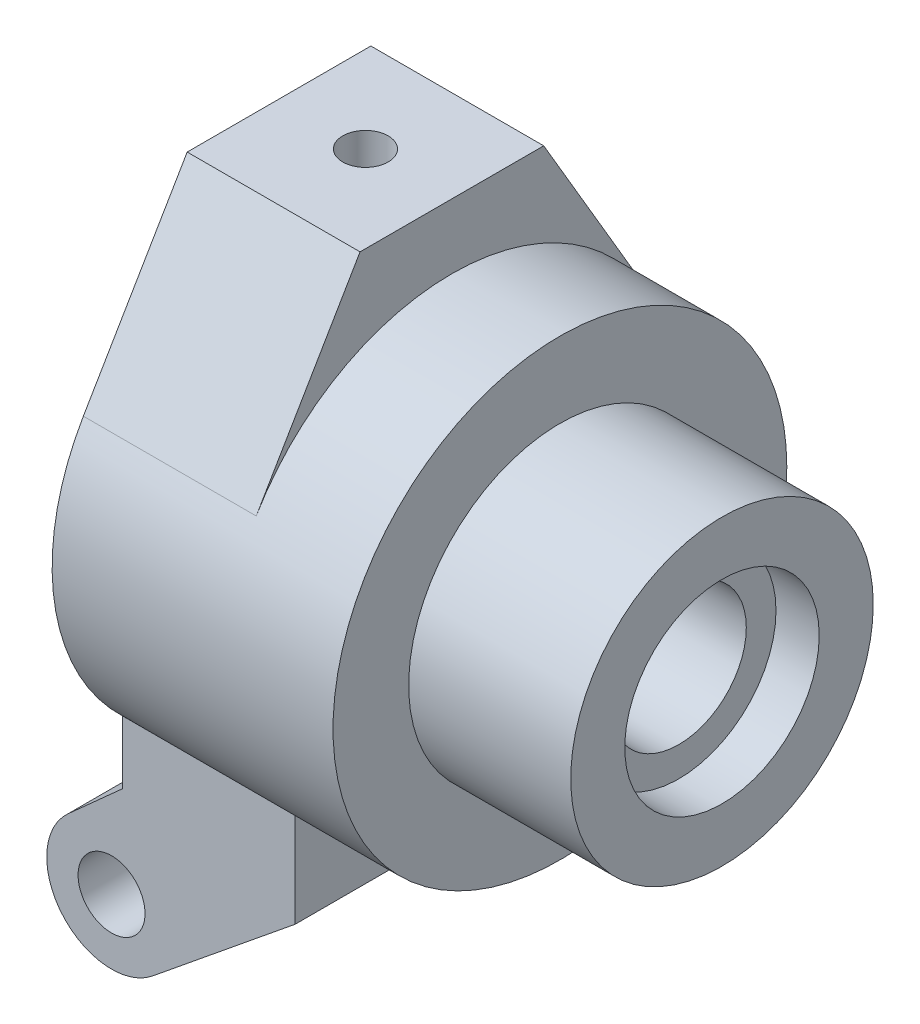
ISO-10303-21;
HEADER;
FILE_DESCRIPTION(('STEP AP214'),'2;1');
FILE_NAME('part.step','',(''),(''),'','','');
FILE_SCHEMA(('AUTOMOTIVE_DESIGN { 1 0 10303 214 1 1 1 1 }'));
ENDSEC;
DATA;
#1=APPLICATION_CONTEXT('core data for automotive mechanical design processes');
#2=APPLICATION_PROTOCOL_DEFINITION('international standard','automotive_design',2000,#1);
#3=PRODUCT_CONTEXT('',#1,'mechanical');
#4=PRODUCT('Part','Part','',(#3));
#5=PRODUCT_RELATED_PRODUCT_CATEGORY('part','',(#4));
#6=PRODUCT_DEFINITION_FORMATION('','',#4);
#7=PRODUCT_DEFINITION_CONTEXT('part definition',#1,'design');
#8=PRODUCT_DEFINITION('design','',#6,#7);
#9=PRODUCT_DEFINITION_SHAPE('','',#8);
#10=(LENGTH_UNIT() NAMED_UNIT(*) SI_UNIT(.MILLI.,.METRE.));
#11=(NAMED_UNIT(*) PLANE_ANGLE_UNIT() SI_UNIT($,.RADIAN.));
#12=(NAMED_UNIT(*) SI_UNIT($,.STERADIAN.) SOLID_ANGLE_UNIT());
#13=UNCERTAINTY_MEASURE_WITH_UNIT(LENGTH_MEASURE(1.E-05),#10,'distance_accuracy_value','');
#14=(GEOMETRIC_REPRESENTATION_CONTEXT(3) GLOBAL_UNCERTAINTY_ASSIGNED_CONTEXT((#13)) GLOBAL_UNIT_ASSIGNED_CONTEXT((#10,
#11,#12)) REPRESENTATION_CONTEXT('',''));
#15=CARTESIAN_POINT('',(0.,0.,0.));
#16=DIRECTION('',(0.,0.,1.));
#17=DIRECTION('',(1.,0.,0.));
#18=AXIS2_PLACEMENT_3D('',#15,#16,#17);
#19=CARTESIAN_POINT('',(41.,0.,0.));
#20=DIRECTION('',(-1.,0.,0.));
#21=DIRECTION('',(0.,0.,1.));
#22=AXIS2_PLACEMENT_3D('',#19,#20,#21);
#23=CYLINDRICAL_SURFACE('',#22,6.25);
#24=CARTESIAN_POINT('',(20.,0.,0.));
#25=DIRECTION('',(-1.,0.,0.));
#26=DIRECTION('',(0.,0.,1.));
#27=AXIS2_PLACEMENT_3D('',#24,#25,#26);
#28=CIRCLE('',#27,6.25);
#29=CARTESIAN_POINT('',(20.,0.,6.25));
#30=VERTEX_POINT('',#29);
#31=EDGE_CURVE('E569',#30,#30,#28,.T.);
#32=ORIENTED_EDGE('',*,*,#31,.T.);
#33=EDGE_LOOP('',(#32));
#34=FACE_BOUND('',#33,.T.);
#35=CARTESIAN_POINT('',(37.,0.,0.));
#36=DIRECTION('',(1.,0.,0.));
#37=DIRECTION('',(0.,0.,-1.));
#38=AXIS2_PLACEMENT_3D('',#35,#36,#37);
#39=CIRCLE('',#38,6.25);
#40=CARTESIAN_POINT('',(37.,0.,-6.25));
#41=VERTEX_POINT('',#40);
#42=EDGE_CURVE('E48',#41,#41,#39,.F.);
#43=ORIENTED_EDGE('',*,*,#42,.F.);
#44=EDGE_LOOP('',(#43));
#45=FACE_BOUND('',#44,.T.);
#46=ADVANCED_FACE('F44',(#34,#45),#23,.F.);
#47=CARTESIAN_POINT('',(26.,0.,0.));
#48=DIRECTION('',(-1.,0.,0.));
#49=DIRECTION('',(0.,0.,1.));
#50=AXIS2_PLACEMENT_3D('',#47,#48,#49);
#51=CYLINDRICAL_SURFACE('',#50,21.);
#52=CARTESIAN_POINT('',(26.,0.,0.));
#53=DIRECTION('',(1.,0.,0.));
#54=DIRECTION('',(0.,0.,-1.));
#55=AXIS2_PLACEMENT_3D('',#52,#53,#54);
#56=CIRCLE('',#55,21.);
#57=CARTESIAN_POINT('',(26.,0.,-21.));
#58=VERTEX_POINT('',#57);
#59=EDGE_CURVE('E211',#58,#58,#56,.T.);
#60=ORIENTED_EDGE('',*,*,#59,.F.);
#61=EDGE_LOOP('',(#60));
#62=FACE_BOUND('',#61,.T.);
#63=CARTESIAN_POINT('',(0.,0.,0.));
#64=DIRECTION('',(1.,0.,0.));
#65=DIRECTION('',(0.,0.,-1.));
#66=AXIS2_PLACEMENT_3D('',#63,#64,#65);
#67=CIRCLE('',#66,21.);
#68=CARTESIAN_POINT('',(0.,10.6321683095735,18.109583016649));
#69=VERTEX_POINT('',#68);
#70=CARTESIAN_POINT('',(0.,-15.1904575309633,14.5));
#71=VERTEX_POINT('',#70);
#72=EDGE_CURVE('E215',#69,#71,#67,.T.);
#73=ORIENTED_EDGE('',*,*,#72,.T.);
#74=DIRECTION('',(-1.,0.,0.));
#75=VECTOR('',#74,1.);
#76=CARTESIAN_POINT('',(26.,-15.1904575309633,14.5));
#77=LINE('',#76,#75);
#78=CARTESIAN_POINT('',(16.,-15.1904575309633,14.5));
#79=VERTEX_POINT('',#78);
#80=EDGE_CURVE('E60',#71,#79,#77,.F.);
#81=ORIENTED_EDGE('',*,*,#80,.T.);
#82=CARTESIAN_POINT('',(16.,0.,0.));
#83=DIRECTION('',(1.,0.,0.));
#84=DIRECTION('',(0.,1.,0.));
#85=AXIS2_PLACEMENT_3D('',#82,#83,#84);
#86=CIRCLE('',#85,21.);
#87=CARTESIAN_POINT('',(16.,-15.1904575309633,-14.5));
#88=VERTEX_POINT('',#87);
#89=EDGE_CURVE('E11',#79,#88,#86,.T.);
#90=ORIENTED_EDGE('',*,*,#89,.T.);
#91=DIRECTION('',(-1.,0.,0.));
#92=VECTOR('',#91,1.);
#93=CARTESIAN_POINT('',(26.,-15.1904575309633,-14.5));
#94=LINE('',#93,#92);
#95=CARTESIAN_POINT('',(0.,-15.1904575309633,-14.5));
#96=VERTEX_POINT('',#95);
#97=EDGE_CURVE('E66',#96,#88,#94,.F.);
#98=ORIENTED_EDGE('',*,*,#97,.F.);
#99=CARTESIAN_POINT('',(0.,10.6321683095735,-18.109583016649));
#100=VERTEX_POINT('',#99);
#101=EDGE_CURVE('E207',#96,#100,#67,.T.);
#102=ORIENTED_EDGE('',*,*,#101,.T.);
#103=DIRECTION('',(-1.,0.,0.));
#104=VECTOR('',#103,1.);
#105=CARTESIAN_POINT('',(16.,10.6321683095735,-18.109583016649));
#106=LINE('',#105,#104);
#107=CARTESIAN_POINT('',(16.,10.6321683095735,-18.109583016649));
#108=VERTEX_POINT('',#107);
#109=EDGE_CURVE('E189',#108,#100,#106,.T.);
#110=ORIENTED_EDGE('',*,*,#109,.F.);
#111=CARTESIAN_POINT('',(16.,0.,0.));
#112=DIRECTION('',(-1.,0.,0.));
#113=DIRECTION('',(0.,0.,1.));
#114=AXIS2_PLACEMENT_3D('',#111,#112,#113);
#115=CIRCLE('',#114,21.);
#116=CARTESIAN_POINT('',(16.,10.6321683095735,18.109583016649));
#117=VERTEX_POINT('',#116);
#118=EDGE_CURVE('E163',#117,#108,#115,.T.);
#119=ORIENTED_EDGE('',*,*,#118,.F.);
#120=DIRECTION('',(-1.,0.,0.));
#121=VECTOR('',#120,1.);
#122=CARTESIAN_POINT('',(16.,10.6321683095735,18.109583016649));
#123=LINE('',#122,#121);
#124=EDGE_CURVE('E179',#117,#69,#123,.T.);
#125=ORIENTED_EDGE('',*,*,#124,.T.);
#126=EDGE_LOOP('',(#73,#81,#90,#98,#102,#110,#119,#125));
#127=FACE_BOUND('',#126,.T.);
#128=ADVANCED_FACE('F46',(#62,#127),#51,.T.);
#129=CARTESIAN_POINT('',(26.,0.,0.));
#130=DIRECTION('',(1.,0.,0.));
#131=DIRECTION('',(0.,0.,-1.));
#132=AXIS2_PLACEMENT_3D('',#129,#130,#131);
#133=PLANE('',#132);
#134=CARTESIAN_POINT('',(26.,0.,0.));
#135=DIRECTION('',(1.,0.,0.));
#136=DIRECTION('',(0.,0.,-1.));
#137=AXIS2_PLACEMENT_3D('',#134,#135,#136);
#138=CIRCLE('',#137,14.);
#139=CARTESIAN_POINT('',(26.,0.,-14.));
#140=VERTEX_POINT('',#139);
#141=EDGE_CURVE('E54',#140,#140,#138,.T.);
#142=ORIENTED_EDGE('',*,*,#141,.F.);
#143=EDGE_LOOP('',(#142));
#144=FACE_BOUND('',#143,.T.);
#145=ORIENTED_EDGE('',*,*,#59,.T.);
#146=EDGE_LOOP('',(#145));
#147=FACE_BOUND('',#146,.T.);
#148=ADVANCED_FACE('F258',(#144,#147),#133,.T.);
#149=CARTESIAN_POINT('',(0.,0.,0.));
#150=DIRECTION('',(1.,0.,0.));
#151=DIRECTION('',(0.,0.,-1.));
#152=AXIS2_PLACEMENT_3D('',#149,#150,#151);
#153=PLANE('',#152);
#154=CARTESIAN_POINT('',(0.,0.,0.));
#155=DIRECTION('',(-1.,0.,0.));
#156=DIRECTION('',(0.,0.,1.));
#157=AXIS2_PLACEMENT_3D('',#154,#155,#156);
#158=CIRCLE('',#157,17.);
#159=CARTESIAN_POINT('',(0.,0.,17.));
#160=VERTEX_POINT('',#159);
#161=EDGE_CURVE('E519',#160,#160,#158,.T.);
#162=ORIENTED_EDGE('',*,*,#161,.F.);
#163=EDGE_LOOP('',(#162));
#164=FACE_BOUND('',#163,.T.);
#165=ORIENTED_EDGE('',*,*,#101,.F.);
#166=DIRECTION('',(0.,-1.,0.));
#167=VECTOR('',#166,1.);
#168=CARTESIAN_POINT('',(0.,0.,-14.5));
#169=LINE('',#168,#167);
#170=CARTESIAN_POINT('',(0.,-21.0414451187089,-14.5));
#171=VERTEX_POINT('',#170);
#172=EDGE_CURVE('E554',#96,#171,#169,.T.);
#173=ORIENTED_EDGE('',*,*,#172,.T.);
#174=DIRECTION('',(0.,0.,-1.));
#175=VECTOR('',#174,1.);
#176=CARTESIAN_POINT('',(0.,-21.0414451187089,14.5));
#177=LINE('',#176,#175);
#178=CARTESIAN_POINT('',(0.,-21.0414451187089,14.5));
#179=VERTEX_POINT('',#178);
#180=EDGE_CURVE('E542',#179,#171,#177,.T.);
#181=ORIENTED_EDGE('',*,*,#180,.F.);
#182=DIRECTION('',(0.,-1.,0.));
#183=VECTOR('',#182,1.);
#184=CARTESIAN_POINT('',(0.,0.,14.5));
#185=LINE('',#184,#183);
#186=EDGE_CURVE('E139',#71,#179,#185,.T.);
#187=ORIENTED_EDGE('',*,*,#186,.F.);
#188=ORIENTED_EDGE('',*,*,#72,.F.);
#189=DIRECTION('',(0.,-0.862361096030904,0.506293729027309));
#190=VECTOR('',#189,1.);
#191=CARTESIAN_POINT('',(0.,10.6321683095735,18.109583016649));
#192=LINE('',#191,#190);
#193=CARTESIAN_POINT('',(0.,27.,8.5));
#194=VERTEX_POINT('',#193);
#195=EDGE_CURVE('E162',#194,#69,#192,.T.);
#196=ORIENTED_EDGE('',*,*,#195,.F.);
#197=DIRECTION('',(0.,0.,1.));
#198=VECTOR('',#197,1.);
#199=CARTESIAN_POINT('',(0.,27.,0.));
#200=LINE('',#199,#198);
#201=CARTESIAN_POINT('',(0.,27.,-8.5));
#202=VERTEX_POINT('',#201);
#203=EDGE_CURVE('E183',#202,#194,#200,.T.);
#204=ORIENTED_EDGE('',*,*,#203,.F.);
#205=DIRECTION('',(0.,-0.862361096030904,-0.506293729027308));
#206=VECTOR('',#205,1.);
#207=CARTESIAN_POINT('',(0.,10.6321683095735,-18.109583016649));
#208=LINE('',#207,#206);
#209=EDGE_CURVE('E168',#202,#100,#208,.T.);
#210=ORIENTED_EDGE('',*,*,#209,.T.);
#211=EDGE_LOOP('',(#165,#173,#181,#187,#188,#196,#204,#210));
#212=FACE_BOUND('',#211,.T.);
#213=ADVANCED_FACE('F228',(#164,#212),#153,.F.);
#214=CARTESIAN_POINT('',(41.,0.,0.));
#215=DIRECTION('',(-1.,0.,0.));
#216=DIRECTION('',(0.,0.,1.));
#217=AXIS2_PLACEMENT_3D('',#214,#215,#216);
#218=CYLINDRICAL_SURFACE('',#217,14.);
#219=CARTESIAN_POINT('',(41.,0.,0.));
#220=DIRECTION('',(1.,0.,0.));
#221=DIRECTION('',(0.,0.,-1.));
#222=AXIS2_PLACEMENT_3D('',#219,#220,#221);
#223=CIRCLE('',#222,14.);
#224=CARTESIAN_POINT('',(41.,0.,-14.));
#225=VERTEX_POINT('',#224);
#226=EDGE_CURVE('E193',#225,#225,#223,.T.);
#227=ORIENTED_EDGE('',*,*,#226,.F.);
#228=EDGE_LOOP('',(#227));
#229=FACE_BOUND('',#228,.T.);
#230=ORIENTED_EDGE('',*,*,#141,.T.);
#231=EDGE_LOOP('',(#230));
#232=FACE_BOUND('',#231,.T.);
#233=ADVANCED_FACE('F389',(#229,#232),#218,.T.);
#234=CARTESIAN_POINT('',(41.,0.,0.));
#235=DIRECTION('',(1.,0.,0.));
#236=DIRECTION('',(0.,0.,-1.));
#237=AXIS2_PLACEMENT_3D('',#234,#235,#236);
#238=PLANE('',#237);
#239=CARTESIAN_POINT('',(41.,0.,0.));
#240=DIRECTION('',(1.,0.,0.));
#241=DIRECTION('',(0.,0.,-1.));
#242=AXIS2_PLACEMENT_3D('',#239,#240,#241);
#243=CIRCLE('',#242,9.);
#244=CARTESIAN_POINT('',(41.,0.,-9.));
#245=VERTEX_POINT('',#244);
#246=EDGE_CURVE('E573',#245,#245,#243,.T.);
#247=ORIENTED_EDGE('',*,*,#246,.F.);
#248=EDGE_LOOP('',(#247));
#249=FACE_BOUND('',#248,.T.);
#250=ORIENTED_EDGE('',*,*,#226,.T.);
#251=EDGE_LOOP('',(#250));
#252=FACE_BOUND('',#251,.T.);
#253=ADVANCED_FACE('F383',(#249,#252),#238,.T.);
#254=CARTESIAN_POINT('',(16.,10.6321683095735,-18.109583016649));
#255=DIRECTION('',(0.,0.506293729027308,-0.862361096030904));
#256=DIRECTION('',(0.,0.862361096030904,0.506293729027308));
#257=AXIS2_PLACEMENT_3D('',#254,#255,#256);
#258=PLANE('',#257);
#259=ORIENTED_EDGE('',*,*,#209,.F.);
#260=DIRECTION('',(-1.,0.,0.));
#261=VECTOR('',#260,1.);
#262=CARTESIAN_POINT('',(16.,27.,-8.5));
#263=LINE('',#262,#261);
#264=CARTESIAN_POINT('',(16.,27.,-8.5));
#265=VERTEX_POINT('',#264);
#266=EDGE_CURVE('E194',#265,#202,#263,.T.);
#267=ORIENTED_EDGE('',*,*,#266,.F.);
#268=DIRECTION('',(0.,-0.862361096030904,-0.506293729027308));
#269=VECTOR('',#268,1.);
#270=CARTESIAN_POINT('',(16.,10.6321683095735,-18.109583016649));
#271=LINE('',#270,#269);
#272=EDGE_CURVE('E175',#265,#108,#271,.T.);
#273=ORIENTED_EDGE('',*,*,#272,.T.);
#274=ORIENTED_EDGE('',*,*,#109,.T.);
#275=EDGE_LOOP('',(#259,#267,#273,#274));
#276=FACE_BOUND('',#275,.T.);
#277=ADVANCED_FACE('F225',(#276),#258,.T.);
#278=CARTESIAN_POINT('',(16.,27.,0.));
#279=DIRECTION('',(0.,-1.,0.));
#280=DIRECTION('',(0.,0.,-1.));
#281=AXIS2_PLACEMENT_3D('',#278,#279,#280);
#282=PLANE('',#281);
#283=CARTESIAN_POINT('',(8.,27.,0.));
#284=DIRECTION('',(0.,1.,0.));
#285=DIRECTION('',(0.,0.,1.));
#286=AXIS2_PLACEMENT_3D('',#283,#284,#285);
#287=CIRCLE('',#286,2.09999999999999);
#288=CARTESIAN_POINT('',(8.,27.,2.09999999999998));
#289=VERTEX_POINT('',#288);
#290=EDGE_CURVE('E583',#289,#289,#287,.T.);
#291=ORIENTED_EDGE('',*,*,#290,.F.);
#292=EDGE_LOOP('',(#291));
#293=FACE_BOUND('',#292,.T.);
#294=ORIENTED_EDGE('',*,*,#203,.T.);
#295=DIRECTION('',(-1.,0.,0.));
#296=VECTOR('',#295,1.);
#297=CARTESIAN_POINT('',(16.,27.,8.5));
#298=LINE('',#297,#296);
#299=CARTESIAN_POINT('',(16.,27.,8.5));
#300=VERTEX_POINT('',#299);
#301=EDGE_CURVE('E197',#300,#194,#298,.T.);
#302=ORIENTED_EDGE('',*,*,#301,.F.);
#303=DIRECTION('',(0.,0.,1.));
#304=VECTOR('',#303,1.);
#305=CARTESIAN_POINT('',(16.,27.,0.));
#306=LINE('',#305,#304);
#307=EDGE_CURVE('E172',#265,#300,#306,.T.);
#308=ORIENTED_EDGE('',*,*,#307,.F.);
#309=ORIENTED_EDGE('',*,*,#266,.T.);
#310=EDGE_LOOP('',(#294,#302,#308,#309));
#311=FACE_BOUND('',#310,.T.);
#312=ADVANCED_FACE('F232',(#293,#311),#282,.F.);
#313=CARTESIAN_POINT('',(16.,10.6321683095735,18.109583016649));
#314=DIRECTION('',(0.,-0.506293729027308,-0.862361096030904));
#315=DIRECTION('',(0.,0.862361096030904,-0.506293729027309));
#316=AXIS2_PLACEMENT_3D('',#313,#314,#315);
#317=PLANE('',#316);
#318=ORIENTED_EDGE('',*,*,#195,.T.);
#319=ORIENTED_EDGE('',*,*,#124,.F.);
#320=DIRECTION('',(0.,-0.862361096030904,0.506293729027309));
#321=VECTOR('',#320,1.);
#322=CARTESIAN_POINT('',(16.,10.6321683095735,18.109583016649));
#323=LINE('',#322,#321);
#324=EDGE_CURVE('E167',#300,#117,#323,.T.);
#325=ORIENTED_EDGE('',*,*,#324,.F.);
#326=ORIENTED_EDGE('',*,*,#301,.T.);
#327=EDGE_LOOP('',(#318,#319,#325,#326));
#328=FACE_BOUND('',#327,.T.);
#329=ADVANCED_FACE('F236',(#328),#317,.F.);
#330=CARTESIAN_POINT('',(16.,0.,0.));
#331=DIRECTION('',(-1.,0.,0.));
#332=DIRECTION('',(0.,0.,1.));
#333=AXIS2_PLACEMENT_3D('',#330,#331,#332);
#334=PLANE('',#333);
#335=ORIENTED_EDGE('',*,*,#118,.T.);
#336=ORIENTED_EDGE('',*,*,#272,.F.);
#337=ORIENTED_EDGE('',*,*,#307,.T.);
#338=ORIENTED_EDGE('',*,*,#324,.T.);
#339=EDGE_LOOP('',(#335,#336,#337,#338));
#340=FACE_BOUND('',#339,.T.);
#341=ADVANCED_FACE('F239',(#340),#334,.F.);
#342=CARTESIAN_POINT('',(0.,0.,14.5));
#343=DIRECTION('',(0.,0.,1.));
#344=DIRECTION('',(1.,0.,0.));
#345=AXIS2_PLACEMENT_3D('',#342,#343,#344);
#346=PLANE('',#345);
#347=CARTESIAN_POINT('',(-0.999999999999997,-30.,14.5));
#348=DIRECTION('',(0.,0.,1.));
#349=DIRECTION('',(1.,0.,0.));
#350=AXIS2_PLACEMENT_3D('',#347,#348,#349);
#351=CIRCLE('',#350,3.1);
#352=CARTESIAN_POINT('',(-4.1,-30.,14.5));
#353=VERTEX_POINT('',#352);
#354=EDGE_CURVE('E538',#353,#353,#351,.T.);
#355=ORIENTED_EDGE('',*,*,#354,.F.);
#356=EDGE_LOOP('',(#355));
#357=FACE_BOUND('',#356,.T.);
#358=ORIENTED_EDGE('',*,*,#80,.F.);
#359=ORIENTED_EDGE('',*,*,#186,.T.);
#360=DIRECTION('',(-0.744299307615422,-0.667846195379748,0.));
#361=VECTOR('',#360,1.);
#362=CARTESIAN_POINT('',(10.4592281114805,-11.6565704729966,14.5));
#363=LINE('',#362,#361);
#364=CARTESIAN_POINT('',(-5.00707717227848,-25.5342041543075,14.5));
#365=VERTEX_POINT('',#364);
#366=EDGE_CURVE('E134',#179,#365,#363,.T.);
#367=ORIENTED_EDGE('',*,*,#366,.T.);
#368=CARTESIAN_POINT('',(-0.999999999999997,-30.,14.5));
#369=DIRECTION('',(0.,0.,1.));
#370=DIRECTION('',(1.,0.,0.));
#371=AXIS2_PLACEMENT_3D('',#368,#369,#370);
#372=CIRCLE('',#371,6.);
#373=CARTESIAN_POINT('',(2.78812751509462,-34.6529657133255,14.5));
#374=VERTEX_POINT('',#373);
#375=EDGE_CURVE('E121',#365,#374,#372,.T.);
#376=ORIENTED_EDGE('',*,*,#375,.T.);
#377=DIRECTION('',(-0.775494285554258,-0.631354585849102,0.));
#378=VECTOR('',#377,1.);
#379=CARTESIAN_POINT('',(18.0778751065555,-22.2050954476604,14.5));
#380=LINE('',#379,#378);
#381=CARTESIAN_POINT('',(16.,-23.8967597213796,14.5));
#382=VERTEX_POINT('',#381);
#383=EDGE_CURVE('E133',#382,#374,#380,.T.);
#384=ORIENTED_EDGE('',*,*,#383,.F.);
#385=DIRECTION('',(0.,-1.,0.));
#386=VECTOR('',#385,1.);
#387=CARTESIAN_POINT('',(16.,0.,14.5));
#388=LINE('',#387,#386);
#389=EDGE_CURVE('E534',#79,#382,#388,.T.);
#390=ORIENTED_EDGE('',*,*,#389,.F.);
#391=EDGE_LOOP('',(#358,#359,#367,#376,#384,#390));
#392=FACE_BOUND('',#391,.T.);
#393=ADVANCED_FACE('F137',(#357,#392),#346,.T.);
#394=CARTESIAN_POINT('',(0.,0.,-14.5));
#395=DIRECTION('',(0.,0.,1.));
#396=DIRECTION('',(1.,0.,0.));
#397=AXIS2_PLACEMENT_3D('',#394,#395,#396);
#398=PLANE('',#397);
#399=CARTESIAN_POINT('',(-0.999999999999997,-30.,-14.5));
#400=DIRECTION('',(0.,0.,1.));
#401=DIRECTION('',(1.,0.,0.));
#402=AXIS2_PLACEMENT_3D('',#399,#400,#401);
#403=CIRCLE('',#402,3.1);
#404=CARTESIAN_POINT('',(-4.1,-30.,-14.5));
#405=VERTEX_POINT('',#404);
#406=EDGE_CURVE('E144',#405,#405,#403,.T.);
#407=ORIENTED_EDGE('',*,*,#406,.T.);
#408=EDGE_LOOP('',(#407));
#409=FACE_BOUND('',#408,.T.);
#410=ORIENTED_EDGE('',*,*,#172,.F.);
#411=ORIENTED_EDGE('',*,*,#97,.T.);
#412=DIRECTION('',(0.,-1.,0.));
#413=VECTOR('',#412,1.);
#414=CARTESIAN_POINT('',(16.,0.,-14.5));
#415=LINE('',#414,#413);
#416=CARTESIAN_POINT('',(16.,-23.8967597213796,-14.5));
#417=VERTEX_POINT('',#416);
#418=EDGE_CURVE('E551',#88,#417,#415,.T.);
#419=ORIENTED_EDGE('',*,*,#418,.T.);
#420=DIRECTION('',(-0.775494285554258,-0.631354585849102,0.));
#421=VECTOR('',#420,1.);
#422=CARTESIAN_POINT('',(18.0778751065555,-22.2050954476604,-14.5));
#423=LINE('',#422,#421);
#424=CARTESIAN_POINT('',(2.78812751509462,-34.6529657133255,-14.5));
#425=VERTEX_POINT('',#424);
#426=EDGE_CURVE('E547',#417,#425,#423,.T.);
#427=ORIENTED_EDGE('',*,*,#426,.T.);
#428=CARTESIAN_POINT('',(-0.999999999999997,-30.,-14.5));
#429=DIRECTION('',(0.,0.,1.));
#430=DIRECTION('',(1.,0.,0.));
#431=AXIS2_PLACEMENT_3D('',#428,#429,#430);
#432=CIRCLE('',#431,6.);
#433=CARTESIAN_POINT('',(-5.00707717227848,-25.5342041543075,-14.5));
#434=VERTEX_POINT('',#433);
#435=EDGE_CURVE('E545',#434,#425,#432,.T.);
#436=ORIENTED_EDGE('',*,*,#435,.F.);
#437=DIRECTION('',(-0.744299307615422,-0.667846195379748,0.));
#438=VECTOR('',#437,1.);
#439=CARTESIAN_POINT('',(10.4592281114805,-11.6565704729966,-14.5));
#440=LINE('',#439,#438);
#441=EDGE_CURVE('E148',#171,#434,#440,.T.);
#442=ORIENTED_EDGE('',*,*,#441,.F.);
#443=EDGE_LOOP('',(#410,#411,#419,#427,#436,#442));
#444=FACE_BOUND('',#443,.T.);
#445=ADVANCED_FACE('F246',(#409,#444),#398,.F.);
#446=CARTESIAN_POINT('',(10.4592281114805,-11.6565704729966,14.5));
#447=DIRECTION('',(0.667846195379748,-0.744299307615422,0.));
#448=DIRECTION('',(0.744299307615422,0.667846195379748,0.));
#449=AXIS2_PLACEMENT_3D('',#446,#447,#448);
#450=PLANE('',#449);
#451=ORIENTED_EDGE('',*,*,#441,.T.);
#452=DIRECTION('',(0.,0.,-1.));
#453=VECTOR('',#452,1.);
#454=CARTESIAN_POINT('',(-5.00707717227848,-25.5342041543075,14.5));
#455=LINE('',#454,#453);
#456=EDGE_CURVE('E126',#365,#434,#455,.T.);
#457=ORIENTED_EDGE('',*,*,#456,.F.);
#458=ORIENTED_EDGE('',*,*,#366,.F.);
#459=ORIENTED_EDGE('',*,*,#180,.T.);
#460=EDGE_LOOP('',(#451,#457,#458,#459));
#461=FACE_BOUND('',#460,.T.);
#462=ADVANCED_FACE('F146',(#461),#450,.F.);
#463=CARTESIAN_POINT('',(-0.999999999999997,-30.,14.5));
#464=DIRECTION('',(0.,0.,-1.));
#465=DIRECTION('',(-1.,0.,0.));
#466=AXIS2_PLACEMENT_3D('',#463,#464,#465);
#467=CYLINDRICAL_SURFACE('',#466,6.);
#468=ORIENTED_EDGE('',*,*,#435,.T.);
#469=DIRECTION('',(0.,0.,-1.));
#470=VECTOR('',#469,1.);
#471=CARTESIAN_POINT('',(2.78812751509462,-34.6529657133255,14.5));
#472=LINE('',#471,#470);
#473=EDGE_CURVE('E128',#374,#425,#472,.T.);
#474=ORIENTED_EDGE('',*,*,#473,.F.);
#475=ORIENTED_EDGE('',*,*,#375,.F.);
#476=ORIENTED_EDGE('',*,*,#456,.T.);
#477=EDGE_LOOP('',(#468,#474,#475,#476));
#478=FACE_BOUND('',#477,.T.);
#479=ADVANCED_FACE('F124',(#478),#467,.T.);
#480=CARTESIAN_POINT('',(18.0778751065555,-22.2050954476604,14.5));
#481=DIRECTION('',(0.631354585849102,-0.775494285554258,0.));
#482=DIRECTION('',(0.775494285554258,0.631354585849102,0.));
#483=AXIS2_PLACEMENT_3D('',#480,#481,#482);
#484=PLANE('',#483);
#485=ORIENTED_EDGE('',*,*,#426,.F.);
#486=DIRECTION('',(0.,0.,-1.));
#487=VECTOR('',#486,1.);
#488=CARTESIAN_POINT('',(16.,-23.8967597213796,14.5));
#489=LINE('',#488,#487);
#490=EDGE_CURVE('E156',#382,#417,#489,.T.);
#491=ORIENTED_EDGE('',*,*,#490,.F.);
#492=ORIENTED_EDGE('',*,*,#383,.T.);
#493=ORIENTED_EDGE('',*,*,#473,.T.);
#494=EDGE_LOOP('',(#485,#491,#492,#493));
#495=FACE_BOUND('',#494,.T.);
#496=ADVANCED_FACE('F293',(#495),#484,.T.);
#497=CARTESIAN_POINT('',(16.,0.,14.5));
#498=DIRECTION('',(1.,0.,0.));
#499=DIRECTION('',(0.,1.,0.));
#500=AXIS2_PLACEMENT_3D('',#497,#498,#499);
#501=PLANE('',#500);
#502=ORIENTED_EDGE('',*,*,#89,.F.);
#503=ORIENTED_EDGE('',*,*,#389,.T.);
#504=ORIENTED_EDGE('',*,*,#490,.T.);
#505=ORIENTED_EDGE('',*,*,#418,.F.);
#506=EDGE_LOOP('',(#502,#503,#504,#505));
#507=FACE_BOUND('',#506,.T.);
#508=ADVANCED_FACE('F289',(#507),#501,.T.);
#509=CARTESIAN_POINT('',(-0.999999999999997,-30.,14.5));
#510=DIRECTION('',(0.,0.,-1.));
#511=DIRECTION('',(-1.,0.,0.));
#512=AXIS2_PLACEMENT_3D('',#509,#510,#511);
#513=CYLINDRICAL_SURFACE('',#512,3.1);
#514=CARTESIAN_POINT('',(-4.1,-30.,14.5));
#515=CARTESIAN_POINT('',(-4.1,-30.,14.1979166666667));
#516=CARTESIAN_POINT('',(-4.1,-30.,13.8958333333333));
#517=CARTESIAN_POINT('',(-4.1,-30.,13.2916666666667));
#518=CARTESIAN_POINT('',(-4.1,-30.,12.9895833333333));
#519=CARTESIAN_POINT('',(-4.1,-30.,12.3854166666667));
#520=CARTESIAN_POINT('',(-4.1,-30.,12.0833333333333));
#521=CARTESIAN_POINT('',(-4.1,-30.,11.4791666666667));
#522=CARTESIAN_POINT('',(-4.1,-30.,11.1770833333333));
#523=CARTESIAN_POINT('',(-4.1,-30.,10.5729166666667));
#524=CARTESIAN_POINT('',(-4.1,-30.,10.2708333333333));
#525=CARTESIAN_POINT('',(-4.1,-30.,9.66666666666667));
#526=CARTESIAN_POINT('',(-4.1,-30.,9.36458333333333));
#527=CARTESIAN_POINT('',(-4.1,-30.,8.76041666666667));
#528=CARTESIAN_POINT('',(-4.1,-30.,8.45833333333333));
#529=CARTESIAN_POINT('',(-4.1,-30.,7.85416666666667));
#530=CARTESIAN_POINT('',(-4.1,-30.,7.55208333333333));
#531=CARTESIAN_POINT('',(-4.1,-30.,6.94791666666667));
#532=CARTESIAN_POINT('',(-4.1,-30.,6.64583333333333));
#533=CARTESIAN_POINT('',(-4.1,-30.,6.04166666666667));
#534=CARTESIAN_POINT('',(-4.1,-30.,5.73958333333333));
#535=CARTESIAN_POINT('',(-4.1,-30.,5.13541666666667));
#536=CARTESIAN_POINT('',(-4.1,-30.,4.83333333333333));
#537=CARTESIAN_POINT('',(-4.1,-30.,4.22916666666667));
#538=CARTESIAN_POINT('',(-4.1,-30.,3.92708333333333));
#539=CARTESIAN_POINT('',(-4.1,-30.,3.32291666666667));
#540=CARTESIAN_POINT('',(-4.1,-30.,3.02083333333333));
#541=CARTESIAN_POINT('',(-4.1,-30.,2.41666666666667));
#542=CARTESIAN_POINT('',(-4.1,-30.,2.11458333333333));
#543=CARTESIAN_POINT('',(-4.1,-30.,1.51041666666667));
#544=CARTESIAN_POINT('',(-4.1,-30.,1.20833333333333));
#545=CARTESIAN_POINT('',(-4.1,-30.,0.604166666666665));
#546=CARTESIAN_POINT('',(-4.1,-30.,0.302083333333332));
#547=CARTESIAN_POINT('',(-4.1,-30.,-0.302083333333335));
#548=CARTESIAN_POINT('',(-4.1,-30.,-0.604166666666669));
#549=CARTESIAN_POINT('',(-4.1,-30.,-1.20833333333333));
#550=CARTESIAN_POINT('',(-4.1,-30.,-1.51041666666667));
#551=CARTESIAN_POINT('',(-4.1,-30.,-2.11458333333333));
#552=CARTESIAN_POINT('',(-4.1,-30.,-2.41666666666667));
#553=CARTESIAN_POINT('',(-4.1,-30.,-3.02083333333333));
#554=CARTESIAN_POINT('',(-4.1,-30.,-3.32291666666666));
#555=CARTESIAN_POINT('',(-4.1,-30.,-3.92708333333333));
#556=CARTESIAN_POINT('',(-4.1,-30.,-4.22916666666667));
#557=CARTESIAN_POINT('',(-4.1,-30.,-4.83333333333333));
#558=CARTESIAN_POINT('',(-4.1,-30.,-5.13541666666667));
#559=CARTESIAN_POINT('',(-4.1,-30.,-5.73958333333333));
#560=CARTESIAN_POINT('',(-4.1,-30.,-6.04166666666667));
#561=CARTESIAN_POINT('',(-4.1,-30.,-6.64583333333333));
#562=CARTESIAN_POINT('',(-4.1,-30.,-6.94791666666667));
#563=CARTESIAN_POINT('',(-4.1,-30.,-7.55208333333333));
#564=CARTESIAN_POINT('',(-4.1,-30.,-7.85416666666667));
#565=CARTESIAN_POINT('',(-4.1,-30.,-8.45833333333333));
#566=CARTESIAN_POINT('',(-4.1,-30.,-8.76041666666667));
#567=CARTESIAN_POINT('',(-4.1,-30.,-9.36458333333333));
#568=CARTESIAN_POINT('',(-4.1,-30.,-9.66666666666667));
#569=CARTESIAN_POINT('',(-4.1,-30.,-10.2708333333333));
#570=CARTESIAN_POINT('',(-4.1,-30.,-10.5729166666667));
#571=CARTESIAN_POINT('',(-4.1,-30.,-11.1770833333333));
#572=CARTESIAN_POINT('',(-4.1,-30.,-11.4791666666667));
#573=CARTESIAN_POINT('',(-4.1,-30.,-12.0833333333333));
#574=CARTESIAN_POINT('',(-4.1,-30.,-12.3854166666667));
#575=CARTESIAN_POINT('',(-4.1,-30.,-12.9895833333333));
#576=CARTESIAN_POINT('',(-4.1,-30.,-13.2916666666667));
#577=CARTESIAN_POINT('',(-4.1,-30.,-13.8958333333333));
#578=CARTESIAN_POINT('',(-4.1,-30.,-14.1979166666667));
#579=CARTESIAN_POINT('',(-4.1,-30.,-14.5));
#580=B_SPLINE_CURVE_WITH_KNOTS('',3,(#514,#515,#516,#517,#518,#519,#520,#521,#522,#523,#524,
#525,#526,#527,#528,#529,#530,#531,#532,#533,#534,#535,#536,#537,#538,#539,#540,#541,#542,#543,
#544,#545,#546,#547,#548,#549,#550,#551,#552,#553,#554,#555,#556,#557,#558,#559,#560,#561,#562,
#563,#564,#565,#566,#567,#568,#569,#570,#571,#572,#573,#574,#575,#576,#577,#578,#579),
.UNSPECIFIED.,.F.,.F.,(4,2,2,2,2,2,2,2,2,2,2,2,2,2,2,2,2,2,2,2,2,2,2,2,2,2,2,2,2,2,2,2,4),(0.,
0.906249999999999,1.8125,2.71875,3.625,4.53125,5.4375,6.34375,7.25,8.15625,9.0625,9.96875,
10.875,11.78125,12.6875,13.59375,14.5,15.40625,16.3125,17.21875,18.125,19.03125,19.9375,
20.84375,21.75,22.65625,23.5625,24.46875,25.375,26.28125,27.1875,28.09375,29.),.UNSPECIFIED.);
#581=EDGE_CURVE('BSEAM281',#353,#405,#580,.T.);
#582=ORIENTED_EDGE('',*,*,#354,.T.);
#583=ORIENTED_EDGE('',*,*,#406,.F.);
#584=ORIENTED_EDGE('',*,*,#581,.T.);
#585=ORIENTED_EDGE('',*,*,#581,.F.);
#586=EDGE_LOOP('',(#582,#584,#583,#585));
#587=FACE_BOUND('',#586,.T.);
#588=ADVANCED_FACE('F281',(#587),#513,.F.);
#589=CARTESIAN_POINT('',(16.,0.,0.));
#590=DIRECTION('',(-1.,0.,0.));
#591=DIRECTION('',(0.,0.,1.));
#592=AXIS2_PLACEMENT_3D('',#589,#590,#591);
#593=CYLINDRICAL_SURFACE('',#592,17.);
#594=CARTESIAN_POINT('',(8.,16.8697954937219,2.09999999999999));
#595=CARTESIAN_POINT('',(7.88252590810978,16.8697971635509,2.0999949988462));
#596=CARTESIAN_POINT('',(7.76497811817446,16.8710358000522,2.09010948369138));
#597=CARTESIAN_POINT('',(7.53315311252608,16.8758547188184,2.05083005646791));
#598=CARTESIAN_POINT('',(7.4188794577857,16.8794374566325,2.02141568658838));
#599=CARTESIAN_POINT('',(7.19699278174404,16.8885327171406,1.94395823719901));
#600=CARTESIAN_POINT('',(7.08937532776611,16.8940439389231,1.89592771337856));
#601=CARTESIAN_POINT('',(6.88374841364143,16.9063736232222,1.78262806732263));
#602=CARTESIAN_POINT('',(6.78573729782415,16.9131918598716,1.71736192286791));
#603=CARTESIAN_POINT('',(6.60154896305654,16.927409091328,1.5710612915416));
#604=CARTESIAN_POINT('',(6.51543187151187,16.9348107596278,1.48995135748541));
#605=CARTESIAN_POINT('',(6.35799541357371,16.9493368163496,1.31442790688449));
#606=CARTESIAN_POINT('',(6.28667677942149,16.9564611910365,1.22001373242164));
#607=CARTESIAN_POINT('',(6.16064648814591,16.9696572405121,1.02018451168724));
#608=CARTESIAN_POINT('',(6.10598917828882,16.9757254431553,0.914734940340688));
#609=CARTESIAN_POINT('',(6.01518112789295,16.9860960597826,0.696066166701415));
#610=CARTESIAN_POINT('',(5.97902971587233,16.9903985378345,0.582847246486633));
#611=CARTESIAN_POINT('',(5.92643912543856,16.9967341075944,0.352468185953957));
#612=CARTESIAN_POINT('',(5.90990004493173,16.9987786969315,0.235331172384041));
#613=CARTESIAN_POINT('',(5.89669402240021,17.0004073715084,-7.24128411139918E-05));
#614=CARTESIAN_POINT('',(5.90002631587044,16.9999915514068,-0.118338940866126));
#615=CARTESIAN_POINT('',(5.92638831968482,16.9967555685503,-0.35196479825721));
#616=CARTESIAN_POINT('',(5.94931058888887,16.9939485207446,-0.467336458326169));
#617=CARTESIAN_POINT('',(6.01403394966247,16.9862602384194,-0.692582799892728));
#618=CARTESIAN_POINT('',(6.05583539301965,16.9813789652496,-0.802457378917346));
#619=CARTESIAN_POINT('',(6.15724499787535,16.9700681345743,-1.01392363060228));
#620=CARTESIAN_POINT('',(6.21689972314009,16.9636345370059,-1.11549274852882));
#621=CARTESIAN_POINT('',(6.35228864386816,16.9499389766723,-1.30721886019516));
#622=CARTESIAN_POINT('',(6.428023559582,16.9426769768087,-1.39737534246085));
#623=CARTESIAN_POINT('',(6.59402494548915,16.9280802485879,-1.56434805741847));
#624=CARTESIAN_POINT('',(6.68438504012614,16.9207453583323,-1.6410712261765));
#625=CARTESIAN_POINT('',(6.87674997784869,16.9068774137818,-1.77827631384515));
#626=CARTESIAN_POINT('',(6.97875485591212,16.9003443618956,-1.83875818396932));
#627=CARTESIAN_POINT('',(7.19159600421145,16.8888198181352,-1.94176876694155));
#628=CARTESIAN_POINT('',(7.30243586553207,16.8838289571638,-1.98429013483856));
#629=CARTESIAN_POINT('',(7.5297580614814,16.8759662295331,-2.05009073166846));
#630=CARTESIAN_POINT('',(7.64624013048594,16.8730942632234,-2.073370865511));
#631=CARTESIAN_POINT('',(7.8807186282907,16.8698126563053,-2.09990513621462));
#632=CARTESIAN_POINT('',(7.99870002514681,16.8693869186892,-2.10329019276073));
#633=CARTESIAN_POINT('',(8.23354825442057,16.8710034064394,-2.09028355008171));
#634=CARTESIAN_POINT('',(8.35041510997415,16.8730455804633,-2.0738922622839));
#635=CARTESIAN_POINT('',(8.57932519295347,16.8793531039533,-2.02190840564937));
#636=CARTESIAN_POINT('',(8.69138301416823,16.8836111231177,-1.98637913421566));
#637=CARTESIAN_POINT('',(8.90795048532425,16.8938646212188,-1.89719297886327));
#638=CARTESIAN_POINT('',(9.01245987579522,16.8998601598456,-1.84353547216294));
#639=CARTESIAN_POINT('',(9.21155645566995,16.9129517348986,-1.71929370177628));
#640=CARTESIAN_POINT('',(9.30608966455526,16.9200532901959,-1.64862352567588));
#641=CARTESIAN_POINT('',(9.48199987140896,16.9345393564174,-1.49248404005973));
#642=CARTESIAN_POINT('',(9.56337636960949,16.9419238780772,-1.40701416862137));
#643=CARTESIAN_POINT('',(9.71112252982338,16.9561932186694,-1.22312981497981));
#644=CARTESIAN_POINT('',(9.77740620449462,16.9630750297405,-1.12464597752569));
#645=CARTESIAN_POINT('',(9.89249040081432,16.9755186520661,-0.917866912611476));
#646=CARTESIAN_POINT('',(9.94129126779118,16.9810804893927,-0.809571878999551));
#647=CARTESIAN_POINT('',(10.0198823373644,16.9902441296474,-0.586531186744261));
#648=CARTESIAN_POINT('',(10.0497223796043,16.993851067439,-0.471803309383074));
#649=CARTESIAN_POINT('',(10.089706918362,16.9987198108302,-0.238918216432371));
#650=CARTESIAN_POINT('',(10.0998522812088,16.9999817195829,-0.120761151917922));
#651=CARTESIAN_POINT('',(10.1001435441487,17.0000177645079,0.114788346900236));
#652=CARTESIAN_POINT('',(10.0904220906108,16.9988084008276,0.2321806367864));
#653=CARTESIAN_POINT('',(10.0515364353078,16.9940705656708,0.463649493038491));
#654=CARTESIAN_POINT('',(10.0223722448816,16.9905420955468,0.577726061338103));
#655=CARTESIAN_POINT('',(9.94547032598181,16.9815607928575,0.799308917800035));
#656=CARTESIAN_POINT('',(9.89773879509823,16.9761086024669,0.906817384487845));
#657=CARTESIAN_POINT('',(9.78507086269027,16.9638838398078,1.11231931829446));
#658=CARTESIAN_POINT('',(9.72013427604246,16.9571112533322,1.21031268301691));
#659=CARTESIAN_POINT('',(9.57440826488357,16.9429478989078,1.39468060124001));
#660=CARTESIAN_POINT('',(9.49352011833833,16.9355534547034,1.48097684594551));
#661=CARTESIAN_POINT('',(9.31839174075299,16.921009399677,1.63882309903051));
#662=CARTESIAN_POINT('',(9.22414834928202,16.9138598473058,1.7103696071159));
#663=CARTESIAN_POINT('',(9.02457781976451,16.9005863156411,1.83691538986275));
#664=CARTESIAN_POINT('',(8.91921020758749,16.8944663072752,1.89185121864876));
#665=CARTESIAN_POINT('',(8.70072900799606,16.883991370432,1.98317097314759));
#666=CARTESIAN_POINT('',(8.58762401908269,16.8796345186561,2.01957512495652));
#667=CARTESIAN_POINT('',(8.39494162095176,16.8742397335255,2.06405903578059));
#668=CARTESIAN_POINT('',(8.31658073511076,16.8725814163226,2.07751757855168));
#669=CARTESIAN_POINT('',(8.15882445855069,16.8703587359162,2.09548971857127));
#670=CARTESIAN_POINT('',(8.07942907543041,16.8697943646817,2.10000338148619));
#671=CARTESIAN_POINT('',(8.,16.8697954937219,2.09999999999999));
#672=B_SPLINE_CURVE_WITH_KNOTS('',3,(#594,#595,#596,#597,#598,#599,#600,#601,#602,#603,#604,
#605,#606,#607,#608,#609,#610,#611,#612,#613,#614,#615,#616,#617,#618,#619,#620,#621,#622,#623,
#624,#625,#626,#627,#628,#629,#630,#631,#632,#633,#634,#635,#636,#637,#638,#639,#640,#641,#642,
#643,#644,#645,#646,#647,#648,#649,#650,#651,#652,#653,#654,#655,#656,#657,#658,#659,#660,#661,
#662,#663,#664,#665,#666,#667,#668,#669,#670,#671),.UNSPECIFIED.,.T.,.F.,(4,2,2,2,2,2,2,2,2,2,2,
2,2,2,2,2,2,2,2,2,2,2,2,2,2,2,2,2,2,2,2,2,2,2,2,2,2,2,4),(0.,0.352132114878374,
0.704633695499463,1.05689794351535,1.40910137096416,1.76302476031245,2.11696565794157,
2.47204901053912,2.82711947811337,3.18037339574096,3.53361372283038,3.88492904693185,
4.23625091758497,4.58849718893648,4.94075924113963,5.29537266166542,5.64998714738504,
6.00474651269303,6.35948919282147,6.71189484948501,7.06429317482325,7.41553306293535,
7.76678501885203,8.11984941365088,8.47292721672502,8.82796888000241,9.18300352994794,
9.53710104721773,9.89118298810157,10.2429085266342,10.5946338600411,10.9462418916997,
11.2978537067538,11.6517140509102,12.0056582740612,12.3609378181805,12.7158287623595,
12.9539215468799,13.1920125835),.UNSPECIFIED.);
#673=CARTESIAN_POINT('',(8.,16.8697954937219,2.09999999999999));
#674=VERTEX_POINT('',#673);
#675=EDGE_CURVE('E580',#674,#674,#672,.T.);
#676=ORIENTED_EDGE('',*,*,#675,.F.);
#677=EDGE_LOOP('',(#676));
#678=FACE_BOUND('',#677,.T.);
#679=CARTESIAN_POINT('',(16.,0.,0.));
#680=DIRECTION('',(-1.,0.,0.));
#681=DIRECTION('',(0.,0.,1.));
#682=AXIS2_PLACEMENT_3D('',#679,#680,#681);
#683=CIRCLE('',#682,17.);
#684=CARTESIAN_POINT('',(16.,0.,17.));
#685=VERTEX_POINT('',#684);
#686=EDGE_CURVE('E521',#685,#685,#683,.T.);
#687=ORIENTED_EDGE('',*,*,#686,.F.);
#688=EDGE_LOOP('',(#687));
#689=FACE_BOUND('',#688,.T.);
#690=ORIENTED_EDGE('',*,*,#161,.T.);
#691=EDGE_LOOP('',(#690));
#692=FACE_BOUND('',#691,.T.);
#693=ADVANCED_FACE('F278',(#678,#689,#692),#593,.F.);
#694=CARTESIAN_POINT('',(16.,0.,0.));
#695=DIRECTION('',(-1.,0.,0.));
#696=DIRECTION('',(0.,0.,1.));
#697=AXIS2_PLACEMENT_3D('',#694,#695,#696);
#698=PLANE('',#697);
#699=CARTESIAN_POINT('',(16.,0.,0.));
#700=DIRECTION('',(-1.,0.,0.));
#701=DIRECTION('',(0.,0.,1.));
#702=AXIS2_PLACEMENT_3D('',#699,#700,#701);
#703=CIRCLE('',#702,9.);
#704=CARTESIAN_POINT('',(16.,0.,9.));
#705=VERTEX_POINT('',#704);
#706=EDGE_CURVE('E529',#705,#705,#703,.T.);
#707=ORIENTED_EDGE('',*,*,#706,.F.);
#708=EDGE_LOOP('',(#707));
#709=FACE_BOUND('',#708,.T.);
#710=ORIENTED_EDGE('',*,*,#686,.T.);
#711=EDGE_LOOP('',(#710));
#712=FACE_BOUND('',#711,.T.);
#713=ADVANCED_FACE('F274',(#709,#712),#698,.T.);
#714=CARTESIAN_POINT('',(20.,0.,0.));
#715=DIRECTION('',(-1.,0.,0.));
#716=DIRECTION('',(0.,0.,1.));
#717=AXIS2_PLACEMENT_3D('',#714,#715,#716);
#718=CYLINDRICAL_SURFACE('',#717,9.);
#719=CARTESIAN_POINT('',(20.,0.,0.));
#720=DIRECTION('',(-1.,0.,0.));
#721=DIRECTION('',(0.,0.,1.));
#722=AXIS2_PLACEMENT_3D('',#719,#720,#721);
#723=CIRCLE('',#722,9.);
#724=CARTESIAN_POINT('',(20.,0.,9.));
#725=VERTEX_POINT('',#724);
#726=EDGE_CURVE('E522',#725,#725,#723,.T.);
#727=ORIENTED_EDGE('',*,*,#726,.F.);
#728=EDGE_LOOP('',(#727));
#729=FACE_BOUND('',#728,.T.);
#730=ORIENTED_EDGE('',*,*,#706,.T.);
#731=EDGE_LOOP('',(#730));
#732=FACE_BOUND('',#731,.T.);
#733=ADVANCED_FACE('F270',(#729,#732),#718,.F.);
#734=CARTESIAN_POINT('',(20.,0.,0.));
#735=DIRECTION('',(-1.,0.,0.));
#736=DIRECTION('',(0.,0.,1.));
#737=AXIS2_PLACEMENT_3D('',#734,#735,#736);
#738=PLANE('',#737);
#739=ORIENTED_EDGE('',*,*,#31,.F.);
#740=EDGE_LOOP('',(#739));
#741=FACE_BOUND('',#740,.T.);
#742=ORIENTED_EDGE('',*,*,#726,.T.);
#743=EDGE_LOOP('',(#742));
#744=FACE_BOUND('',#743,.T.);
#745=ADVANCED_FACE('F266',(#741,#744),#738,.T.);
#746=CARTESIAN_POINT('',(37.,0.,0.));
#747=DIRECTION('',(1.,0.,0.));
#748=DIRECTION('',(0.,0.,-1.));
#749=AXIS2_PLACEMENT_3D('',#746,#747,#748);
#750=PLANE('',#749);
#751=CARTESIAN_POINT('',(37.,0.,0.));
#752=DIRECTION('',(1.,0.,0.));
#753=DIRECTION('',(0.,0.,-1.));
#754=AXIS2_PLACEMENT_3D('',#751,#752,#753);
#755=CIRCLE('',#754,9.);
#756=CARTESIAN_POINT('',(37.,0.,-9.));
#757=VERTEX_POINT('',#756);
#758=EDGE_CURVE('E571',#757,#757,#755,.T.);
#759=ORIENTED_EDGE('',*,*,#758,.T.);
#760=EDGE_LOOP('',(#759));
#761=FACE_BOUND('',#760,.T.);
#762=ORIENTED_EDGE('',*,*,#42,.T.);
#763=EDGE_LOOP('',(#762));
#764=FACE_BOUND('',#763,.T.);
#765=ADVANCED_FACE('F269',(#761,#764),#750,.T.);
#766=CARTESIAN_POINT('',(37.,0.,0.));
#767=DIRECTION('',(1.,0.,0.));
#768=DIRECTION('',(0.,0.,-1.));
#769=AXIS2_PLACEMENT_3D('',#766,#767,#768);
#770=CYLINDRICAL_SURFACE('',#769,9.);
#771=ORIENTED_EDGE('',*,*,#758,.F.);
#772=EDGE_LOOP('',(#771));
#773=FACE_BOUND('',#772,.T.);
#774=ORIENTED_EDGE('',*,*,#246,.T.);
#775=EDGE_LOOP('',(#774));
#776=FACE_BOUND('',#775,.T.);
#777=ADVANCED_FACE('F264',(#773,#776),#770,.F.);
#778=CARTESIAN_POINT('',(8.,27.,0.));
#779=DIRECTION('',(0.,1.,0.));
#780=DIRECTION('',(0.,0.,1.));
#781=AXIS2_PLACEMENT_3D('',#778,#779,#780);
#782=CYLINDRICAL_SURFACE('',#781,2.09999999999999);
#783=ORIENTED_EDGE('',*,*,#675,.T.);
#784=EDGE_LOOP('',(#783));
#785=FACE_BOUND('',#784,.T.);
#786=ORIENTED_EDGE('',*,*,#290,.T.);
#787=EDGE_LOOP('',(#786));
#788=FACE_BOUND('',#787,.T.);
#789=ADVANCED_FACE('F338',(#785,#788),#782,.F.);
#790=CLOSED_SHELL('',(#46,#128,#148,#213,#233,#253,#277,#312,#329,#341,#393,#445,#462,#479,#496,
#508,#588,#693,#713,#733,#745,#765,#777,#789));
#791=MANIFOLD_SOLID_BREP('B2',#790);
#792=ADVANCED_BREP_SHAPE_REPRESENTATION('',(#18,#791),#14);
#793=SHAPE_DEFINITION_REPRESENTATION(#9,#792);
ENDSEC;
END-ISO-10303-21;
